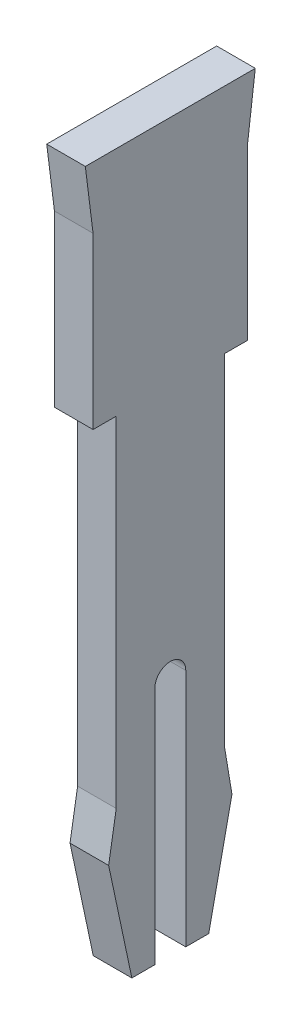
ISO-10303-21;
HEADER;
FILE_DESCRIPTION(('STEP AP214'),'2;1');
FILE_NAME('part.step','',(''),(''),'','','');
FILE_SCHEMA(('AUTOMOTIVE_DESIGN { 1 0 10303 214 1 1 1 1 }'));
ENDSEC;
DATA;
#1=APPLICATION_CONTEXT('core data for automotive mechanical design processes');
#2=APPLICATION_PROTOCOL_DEFINITION('international standard','automotive_design',2000,#1);
#3=PRODUCT_CONTEXT('',#1,'mechanical');
#4=PRODUCT('Part','Part','',(#3));
#5=PRODUCT_RELATED_PRODUCT_CATEGORY('part','',(#4));
#6=PRODUCT_DEFINITION_FORMATION('','',#4);
#7=PRODUCT_DEFINITION_CONTEXT('part definition',#1,'design');
#8=PRODUCT_DEFINITION('design','',#6,#7);
#9=PRODUCT_DEFINITION_SHAPE('','',#8);
#10=(LENGTH_UNIT() NAMED_UNIT(*) SI_UNIT(.MILLI.,.METRE.));
#11=(NAMED_UNIT(*) PLANE_ANGLE_UNIT() SI_UNIT($,.RADIAN.));
#12=(NAMED_UNIT(*) SI_UNIT($,.STERADIAN.) SOLID_ANGLE_UNIT());
#13=UNCERTAINTY_MEASURE_WITH_UNIT(LENGTH_MEASURE(1.E-05),#10,'distance_accuracy_value','');
#14=(GEOMETRIC_REPRESENTATION_CONTEXT(3) GLOBAL_UNCERTAINTY_ASSIGNED_CONTEXT((#13)) GLOBAL_UNIT_ASSIGNED_CONTEXT((#10,
#11,#12)) REPRESENTATION_CONTEXT('',''));
#15=CARTESIAN_POINT('',(0.,0.,0.));
#16=DIRECTION('',(0.,0.,1.));
#17=DIRECTION('',(1.,0.,0.));
#18=AXIS2_PLACEMENT_3D('',#15,#16,#17);
#19=CARTESIAN_POINT('',(6.5,1.325,32.27787898118));
#20=DIRECTION('',(0.,0.,1.));
#21=DIRECTION('',(1.,0.,0.));
#22=AXIS2_PLACEMENT_3D('',#19,#20,#21);
#23=PLANE('',#22);
#24=DIRECTION('',(0.,-1.,0.));
#25=VECTOR('',#24,1.);
#26=CARTESIAN_POINT('',(7.,-3.3,32.27787898118));
#27=LINE('',#26,#25);
#28=CARTESIAN_POINT('',(7.,-3.3,32.27787898118));
#29=VERTEX_POINT('',#28);
#30=CARTESIAN_POINT('',(7.,-6.4,32.27787898118));
#31=VERTEX_POINT('',#30);
#32=EDGE_CURVE('E282',#29,#31,#27,.T.);
#33=ORIENTED_EDGE('',*,*,#32,.F.);
#34=DIRECTION('',(1.,0.,0.));
#35=VECTOR('',#34,1.);
#36=CARTESIAN_POINT('',(6.5,-3.3,32.27787898118));
#37=LINE('',#36,#35);
#38=CARTESIAN_POINT('',(6.5,-3.3,32.27787898118));
#39=VERTEX_POINT('',#38);
#40=EDGE_CURVE('E244',#39,#29,#37,.T.);
#41=ORIENTED_EDGE('',*,*,#40,.F.);
#42=DIRECTION('',(0.,-1.,0.));
#43=VECTOR('',#42,1.);
#44=CARTESIAN_POINT('',(6.5,-3.3,32.27787898118));
#45=LINE('',#44,#43);
#46=CARTESIAN_POINT('',(6.5,-6.4,32.27787898118));
#47=VERTEX_POINT('',#46);
#48=EDGE_CURVE('E245',#39,#47,#45,.T.);
#49=ORIENTED_EDGE('',*,*,#48,.T.);
#50=DIRECTION('',(-1.,0.,0.));
#51=VECTOR('',#50,1.);
#52=CARTESIAN_POINT('',(7.,-6.4,32.27787898118));
#53=LINE('',#52,#51);
#54=EDGE_CURVE('E11',#31,#47,#53,.T.);
#55=ORIENTED_EDGE('',*,*,#54,.F.);
#56=EDGE_LOOP('',(#33,#41,#49,#55));
#57=FACE_BOUND('',#56,.T.);
#58=ADVANCED_FACE('F17',(#57),#23,.T.);
#59=CARTESIAN_POINT('',(7.,-6.4,32.47787898118));
#60=DIRECTION('',(0.,-1.,0.));
#61=DIRECTION('',(0.,0.,-1.));
#62=AXIS2_PLACEMENT_3D('',#59,#60,#61);
#63=PLANE('',#62);
#64=DIRECTION('',(-1.,0.,0.));
#65=VECTOR('',#64,1.);
#66=CARTESIAN_POINT('',(7.,-6.4,31.9801173963));
#67=LINE('',#66,#65);
#68=CARTESIAN_POINT('',(7.,-6.4,31.9801173963));
#69=VERTEX_POINT('',#68);
#70=CARTESIAN_POINT('',(6.5,-6.4,31.9801173963));
#71=VERTEX_POINT('',#70);
#72=EDGE_CURVE('E441',#69,#71,#67,.T.);
#73=ORIENTED_EDGE('',*,*,#72,.F.);
#74=DIRECTION('',(0.,0.,-1.));
#75=VECTOR('',#74,1.);
#76=CARTESIAN_POINT('',(7.,-6.4,32.27787898118));
#77=LINE('',#76,#75);
#78=EDGE_CURVE('E310',#31,#69,#77,.T.);
#79=ORIENTED_EDGE('',*,*,#78,.F.);
#80=ORIENTED_EDGE('',*,*,#54,.T.);
#81=DIRECTION('',(0.,0.,-1.));
#82=VECTOR('',#81,1.);
#83=CARTESIAN_POINT('',(6.5,-6.4,32.27787898118));
#84=LINE('',#83,#82);
#85=EDGE_CURVE('E278',#47,#71,#84,.T.);
#86=ORIENTED_EDGE('',*,*,#85,.T.);
#87=EDGE_LOOP('',(#73,#79,#80,#86));
#88=FACE_BOUND('',#87,.T.);
#89=ADVANCED_FACE('F422',(#88),#63,.T.);
#90=CARTESIAN_POINT('',(6.5,-4.987735989049,31.67963569184));
#91=DIRECTION('',(0.,-0.164398987305406,0.986393923832136));
#92=DIRECTION('',(-1.,0.,0.));
#93=AXIS2_PLACEMENT_3D('',#90,#91,#92);
#94=PLANE('',#93);
#95=DIRECTION('',(1.,-1.030286966852E-13,0.));
#96=VECTOR('',#95,1.);
#97=CARTESIAN_POINT('',(6.5,-4.39827625303,31.77787898118));
#98=LINE('',#97,#96);
#99=CARTESIAN_POINT('',(6.5,-4.39827625303,31.77787898118));
#100=VERTEX_POINT('',#99);
#101=CARTESIAN_POINT('',(7.,-4.39827625303,31.77787898118));
#102=VERTEX_POINT('',#101);
#103=EDGE_CURVE('E25',#100,#102,#98,.T.);
#104=ORIENTED_EDGE('',*,*,#103,.T.);
#105=DIRECTION('',(0.,0.986393923832136,0.164398987305406));
#106=VECTOR('',#105,1.);
#107=CARTESIAN_POINT('',(7.,-4.987735989049,31.67963569184));
#108=LINE('',#107,#106);
#109=CARTESIAN_POINT('',(7.,-4.987735989049,31.67963569184));
#110=VERTEX_POINT('',#109);
#111=EDGE_CURVE('E313',#110,#102,#108,.T.);
#112=ORIENTED_EDGE('',*,*,#111,.F.);
#113=DIRECTION('',(1.,0.,0.));
#114=VECTOR('',#113,1.);
#115=CARTESIAN_POINT('',(6.5,-4.987735989049,31.67963569184));
#116=LINE('',#115,#114);
#117=CARTESIAN_POINT('',(6.5,-4.987735989049,31.67963569184));
#118=VERTEX_POINT('',#117);
#119=EDGE_CURVE('E386',#118,#110,#116,.T.);
#120=ORIENTED_EDGE('',*,*,#119,.F.);
#121=DIRECTION('',(0.,-0.986393923832136,-0.164398987305406));
#122=VECTOR('',#121,1.);
#123=CARTESIAN_POINT('',(6.5,-4.39827625303,31.77787898118));
#124=LINE('',#123,#122);
#125=EDGE_CURVE('E275',#100,#118,#124,.T.);
#126=ORIENTED_EDGE('',*,*,#125,.F.);
#127=EDGE_LOOP('',(#104,#112,#120,#126));
#128=FACE_BOUND('',#127,.T.);
#129=ADVANCED_FACE('F384',(#128),#94,.F.);
#130=CARTESIAN_POINT('',(6.5,-4.39,31.77787898118));
#131=DIRECTION('',(0.,0.,1.));
#132=DIRECTION('',(1.,0.,0.));
#133=AXIS2_PLACEMENT_3D('',#130,#131,#132);
#134=PLANE('',#133);
#135=DIRECTION('',(1.,0.,0.));
#136=VECTOR('',#135,1.);
#137=CARTESIAN_POINT('',(6.5,0.,31.77787898118));
#138=LINE('',#137,#136);
#139=CARTESIAN_POINT('',(6.5,0.,31.77787898118));
#140=VERTEX_POINT('',#139);
#141=CARTESIAN_POINT('',(7.,0.,31.77787898118));
#142=VERTEX_POINT('',#141);
#143=EDGE_CURVE('E306',#140,#142,#138,.T.);
#144=ORIENTED_EDGE('',*,*,#143,.T.);
#145=DIRECTION('',(0.,-1.,0.));
#146=VECTOR('',#145,1.);
#147=CARTESIAN_POINT('',(7.,0.,31.77787898118));
#148=LINE('',#147,#146);
#149=EDGE_CURVE('E317',#142,#102,#148,.T.);
#150=ORIENTED_EDGE('',*,*,#149,.T.);
#151=ORIENTED_EDGE('',*,*,#103,.F.);
#152=DIRECTION('',(0.,1.,0.));
#153=VECTOR('',#152,1.);
#154=CARTESIAN_POINT('',(6.5,-4.39827625303,31.77787898118));
#155=LINE('',#154,#153);
#156=EDGE_CURVE('E265',#100,#140,#155,.T.);
#157=ORIENTED_EDGE('',*,*,#156,.T.);
#158=EDGE_LOOP('',(#144,#150,#151,#157));
#159=FACE_BOUND('',#158,.T.);
#160=ADVANCED_FACE('F368',(#159),#134,.F.);
#161=CARTESIAN_POINT('',(-3.,0.,31.47787898118));
#162=DIRECTION('',(0.,1.,0.));
#163=DIRECTION('',(1.,0.,0.));
#164=AXIS2_PLACEMENT_3D('',#161,#162,#163);
#165=PLANE('',#164);
#166=ORIENTED_EDGE('',*,*,#143,.F.);
#167=DIRECTION('',(0.,0.,-1.));
#168=VECTOR('',#167,1.);
#169=CARTESIAN_POINT('',(6.5,0.,31.77787898118));
#170=LINE('',#169,#168);
#171=CARTESIAN_POINT('',(6.5,0.,31.47787898118));
#172=VERTEX_POINT('',#171);
#173=EDGE_CURVE('E253',#140,#172,#170,.T.);
#174=ORIENTED_EDGE('',*,*,#173,.T.);
#175=DIRECTION('',(1.,0.,0.));
#176=VECTOR('',#175,1.);
#177=CARTESIAN_POINT('',(6.5,0.,31.47787898118));
#178=LINE('',#177,#176);
#179=CARTESIAN_POINT('',(7.,0.,31.47787898118));
#180=VERTEX_POINT('',#179);
#181=EDGE_CURVE('E260',#172,#180,#178,.T.);
#182=ORIENTED_EDGE('',*,*,#181,.T.);
#183=DIRECTION('',(0.,0.,1.));
#184=VECTOR('',#183,1.);
#185=CARTESIAN_POINT('',(7.,0.,31.47787898118));
#186=LINE('',#185,#184);
#187=EDGE_CURVE('E321',#180,#142,#186,.T.);
#188=ORIENTED_EDGE('',*,*,#187,.T.);
#189=EDGE_LOOP('',(#166,#174,#182,#188));
#190=FACE_BOUND('',#189,.T.);
#191=ADVANCED_FACE('F374',(#190),#165,.F.);
#192=CARTESIAN_POINT('',(7.,1.325,31.47787898118));
#193=DIRECTION('',(0.,0.,-1.));
#194=DIRECTION('',(0.,-1.,0.));
#195=AXIS2_PLACEMENT_3D('',#192,#193,#194);
#196=PLANE('',#195);
#197=ORIENTED_EDGE('',*,*,#181,.F.);
#198=DIRECTION('',(0.,1.,0.));
#199=VECTOR('',#198,1.);
#200=CARTESIAN_POINT('',(6.5,0.,31.47787898118));
#201=LINE('',#200,#199);
#202=CARTESIAN_POINT('',(6.5,2.2,31.47787898118));
#203=VERTEX_POINT('',#202);
#204=EDGE_CURVE('E206',#172,#203,#201,.T.);
#205=ORIENTED_EDGE('',*,*,#204,.T.);
#206=DIRECTION('',(-1.,0.,0.));
#207=VECTOR('',#206,1.);
#208=CARTESIAN_POINT('',(7.,2.2,31.47787898118));
#209=LINE('',#208,#207);
#210=CARTESIAN_POINT('',(7.,2.2,31.47787898118));
#211=VERTEX_POINT('',#210);
#212=EDGE_CURVE('E196',#211,#203,#209,.T.);
#213=ORIENTED_EDGE('',*,*,#212,.F.);
#214=DIRECTION('',(0.,1.,0.));
#215=VECTOR('',#214,1.);
#216=CARTESIAN_POINT('',(7.,0.,31.47787898118));
#217=LINE('',#216,#215);
#218=EDGE_CURVE('E325',#180,#211,#217,.T.);
#219=ORIENTED_EDGE('',*,*,#218,.F.);
#220=EDGE_LOOP('',(#197,#205,#213,#219));
#221=FACE_BOUND('',#220,.T.);
#222=ADVANCED_FACE('F390',(#221),#196,.T.);
#223=CARTESIAN_POINT('',(7.,1.215384615385,31.60095590426));
#224=DIRECTION('',(0.,-0.124034734589196,-0.992277876713669));
#225=DIRECTION('',(0.,-0.992277876713669,0.124034734589196));
#226=AXIS2_PLACEMENT_3D('',#223,#224,#225);
#227=PLANE('',#226);
#228=DIRECTION('',(0.,0.992277876713669,-0.124034734589196));
#229=VECTOR('',#228,1.);
#230=CARTESIAN_POINT('',(7.,2.2,31.47787898118));
#231=LINE('',#230,#229);
#232=CARTESIAN_POINT('',(7.,3.,31.37787898118));
#233=VERTEX_POINT('',#232);
#234=EDGE_CURVE('E329',#211,#233,#231,.T.);
#235=ORIENTED_EDGE('',*,*,#234,.F.);
#236=ORIENTED_EDGE('',*,*,#212,.T.);
#237=DIRECTION('',(0.,-0.992277876713669,0.124034734589196));
#238=VECTOR('',#237,1.);
#239=CARTESIAN_POINT('',(6.5,3.,31.37787898118));
#240=LINE('',#239,#238);
#241=CARTESIAN_POINT('',(6.5,3.,31.37787898118));
#242=VERTEX_POINT('',#241);
#243=EDGE_CURVE('E200',#242,#203,#240,.T.);
#244=ORIENTED_EDGE('',*,*,#243,.F.);
#245=DIRECTION('',(-1.,0.,0.));
#246=VECTOR('',#245,1.);
#247=CARTESIAN_POINT('',(7.,3.,31.37787898118));
#248=LINE('',#247,#246);
#249=EDGE_CURVE('E184',#233,#242,#248,.T.);
#250=ORIENTED_EDGE('',*,*,#249,.F.);
#251=EDGE_LOOP('',(#235,#236,#244,#250));
#252=FACE_BOUND('',#251,.T.);
#253=ADVANCED_FACE('F201',(#252),#227,.T.);
#254=CARTESIAN_POINT('',(7.,3.,32.47787898118));
#255=DIRECTION('',(0.,1.,0.));
#256=DIRECTION('',(1.,0.,0.));
#257=AXIS2_PLACEMENT_3D('',#254,#255,#256);
#258=PLANE('',#257);
#259=DIRECTION('',(0.,0.,1.));
#260=VECTOR('',#259,1.);
#261=CARTESIAN_POINT('',(7.,3.,31.37787898118));
#262=LINE('',#261,#260);
#263=CARTESIAN_POINT('',(7.,3.,33.57787898118));
#264=VERTEX_POINT('',#263);
#265=EDGE_CURVE('E191',#233,#264,#262,.T.);
#266=ORIENTED_EDGE('',*,*,#265,.F.);
#267=ORIENTED_EDGE('',*,*,#249,.T.);
#268=DIRECTION('',(0.,0.,1.));
#269=VECTOR('',#268,1.);
#270=CARTESIAN_POINT('',(6.5,3.,31.37787898118));
#271=LINE('',#270,#269);
#272=CARTESIAN_POINT('',(6.5,3.,33.57787898118));
#273=VERTEX_POINT('',#272);
#274=EDGE_CURVE('E188',#242,#273,#271,.T.);
#275=ORIENTED_EDGE('',*,*,#274,.T.);
#276=DIRECTION('',(-1.,0.,0.));
#277=VECTOR('',#276,1.);
#278=CARTESIAN_POINT('',(7.,3.,33.57787898118));
#279=LINE('',#278,#277);
#280=EDGE_CURVE('E197',#264,#273,#279,.T.);
#281=ORIENTED_EDGE('',*,*,#280,.F.);
#282=EDGE_LOOP('',(#266,#267,#275,#281));
#283=FACE_BOUND('',#282,.T.);
#284=ADVANCED_FACE('F186',(#283),#258,.T.);
#285=CARTESIAN_POINT('',(7.,1.215384615385,33.3548020581));
#286=DIRECTION('',(0.,0.124034734589196,-0.992277876713669));
#287=DIRECTION('',(-1.,0.,0.));
#288=AXIS2_PLACEMENT_3D('',#285,#286,#287);
#289=PLANE('',#288);
#290=DIRECTION('',(0.,0.992277876713669,0.124034734589196));
#291=VECTOR('',#290,1.);
#292=CARTESIAN_POINT('',(6.5,2.2,33.47787898118));
#293=LINE('',#292,#291);
#294=CARTESIAN_POINT('',(6.5,2.2,33.47787898118));
#295=VERTEX_POINT('',#294);
#296=EDGE_CURVE('E212',#295,#273,#293,.T.);
#297=ORIENTED_EDGE('',*,*,#296,.F.);
#298=DIRECTION('',(1.,-1.15463194561E-13,0.));
#299=VECTOR('',#298,1.);
#300=CARTESIAN_POINT('',(6.5,2.2,33.47787898118));
#301=LINE('',#300,#299);
#302=CARTESIAN_POINT('',(7.,2.2,33.47787898118));
#303=VERTEX_POINT('',#302);
#304=EDGE_CURVE('E362',#295,#303,#301,.T.);
#305=ORIENTED_EDGE('',*,*,#304,.T.);
#306=DIRECTION('',(0.,-0.992277876713669,-0.124034734589196));
#307=VECTOR('',#306,1.);
#308=CARTESIAN_POINT('',(7.,3.,33.57787898118));
#309=LINE('',#308,#307);
#310=EDGE_CURVE('E334',#264,#303,#309,.T.);
#311=ORIENTED_EDGE('',*,*,#310,.F.);
#312=ORIENTED_EDGE('',*,*,#280,.T.);
#313=EDGE_LOOP('',(#297,#305,#311,#312));
#314=FACE_BOUND('',#313,.T.);
#315=ADVANCED_FACE('F395',(#314),#289,.F.);
#316=CARTESIAN_POINT('',(7.,1.325,33.47787898118));
#317=DIRECTION('',(0.,0.,-1.));
#318=DIRECTION('',(0.,-1.,0.));
#319=AXIS2_PLACEMENT_3D('',#316,#317,#318);
#320=PLANE('',#319);
#321=ORIENTED_EDGE('',*,*,#304,.F.);
#322=DIRECTION('',(0.,-1.,0.));
#323=VECTOR('',#322,1.);
#324=CARTESIAN_POINT('',(6.5,2.2,33.47787898118));
#325=LINE('',#324,#323);
#326=CARTESIAN_POINT('',(6.5,0.,33.47787898118));
#327=VERTEX_POINT('',#326);
#328=EDGE_CURVE('E221',#295,#327,#325,.T.);
#329=ORIENTED_EDGE('',*,*,#328,.T.);
#330=DIRECTION('',(1.,0.,0.));
#331=VECTOR('',#330,1.);
#332=CARTESIAN_POINT('',(6.5,0.,33.47787898118));
#333=LINE('',#332,#331);
#334=CARTESIAN_POINT('',(7.,0.,33.47787898118));
#335=VERTEX_POINT('',#334);
#336=EDGE_CURVE('E359',#327,#335,#333,.T.);
#337=ORIENTED_EDGE('',*,*,#336,.T.);
#338=DIRECTION('',(0.,1.,0.));
#339=VECTOR('',#338,1.);
#340=CARTESIAN_POINT('',(7.,0.,33.47787898118));
#341=LINE('',#340,#339);
#342=EDGE_CURVE('E338',#335,#303,#341,.T.);
#343=ORIENTED_EDGE('',*,*,#342,.T.);
#344=EDGE_LOOP('',(#321,#329,#337,#343));
#345=FACE_BOUND('',#344,.T.);
#346=ADVANCED_FACE('F398',(#345),#320,.F.);
#347=CARTESIAN_POINT('',(-3.,0.,33.27787898118));
#348=DIRECTION('',(0.,1.,0.));
#349=DIRECTION('',(1.,0.,0.));
#350=AXIS2_PLACEMENT_3D('',#347,#348,#349);
#351=PLANE('',#350);
#352=ORIENTED_EDGE('',*,*,#336,.F.);
#353=DIRECTION('',(0.,0.,-1.));
#354=VECTOR('',#353,1.);
#355=CARTESIAN_POINT('',(6.5,0.,33.47787898118));
#356=LINE('',#355,#354);
#357=CARTESIAN_POINT('',(6.5,0.,33.17787898118));
#358=VERTEX_POINT('',#357);
#359=EDGE_CURVE('E235',#327,#358,#356,.T.);
#360=ORIENTED_EDGE('',*,*,#359,.T.);
#361=DIRECTION('',(1.,0.,0.));
#362=VECTOR('',#361,1.);
#363=CARTESIAN_POINT('',(6.5,0.,33.17787898118));
#364=LINE('',#363,#362);
#365=CARTESIAN_POINT('',(7.,0.,33.17787898118));
#366=VERTEX_POINT('',#365);
#367=EDGE_CURVE('E356',#358,#366,#364,.T.);
#368=ORIENTED_EDGE('',*,*,#367,.T.);
#369=DIRECTION('',(0.,0.,1.));
#370=VECTOR('',#369,1.);
#371=CARTESIAN_POINT('',(7.,0.,33.17787898118));
#372=LINE('',#371,#370);
#373=EDGE_CURVE('E342',#366,#335,#372,.T.);
#374=ORIENTED_EDGE('',*,*,#373,.T.);
#375=EDGE_LOOP('',(#352,#360,#368,#374));
#376=FACE_BOUND('',#375,.T.);
#377=ADVANCED_FACE('F401',(#376),#351,.F.);
#378=CARTESIAN_POINT('',(6.5,0.,33.17787898118));
#379=DIRECTION('',(0.,0.,-1.));
#380=DIRECTION('',(0.,-1.,0.));
#381=AXIS2_PLACEMENT_3D('',#378,#379,#380);
#382=PLANE('',#381);
#383=DIRECTION('',(1.,0.,0.));
#384=VECTOR('',#383,1.);
#385=CARTESIAN_POINT('',(6.5,-4.39827625303,33.17787898118));
#386=LINE('',#385,#384);
#387=CARTESIAN_POINT('',(6.5,-4.39827625303,33.17787898118));
#388=VERTEX_POINT('',#387);
#389=CARTESIAN_POINT('',(7.,-4.39827625303,33.17787898118));
#390=VERTEX_POINT('',#389);
#391=EDGE_CURVE('E47',#388,#390,#386,.T.);
#392=ORIENTED_EDGE('',*,*,#391,.T.);
#393=DIRECTION('',(0.,1.,0.));
#394=VECTOR('',#393,1.);
#395=CARTESIAN_POINT('',(7.,-4.39827625303,33.17787898118));
#396=LINE('',#395,#394);
#397=EDGE_CURVE('E271',#390,#366,#396,.T.);
#398=ORIENTED_EDGE('',*,*,#397,.T.);
#399=ORIENTED_EDGE('',*,*,#367,.F.);
#400=DIRECTION('',(0.,-1.,0.));
#401=VECTOR('',#400,1.);
#402=CARTESIAN_POINT('',(6.5,0.,33.17787898118));
#403=LINE('',#402,#401);
#404=EDGE_CURVE('E239',#358,#388,#403,.T.);
#405=ORIENTED_EDGE('',*,*,#404,.T.);
#406=EDGE_LOOP('',(#392,#398,#399,#405));
#407=FACE_BOUND('',#406,.T.);
#408=ADVANCED_FACE('F403',(#407),#382,.F.);
#409=CARTESIAN_POINT('',(6.5,-4.39827625303,33.17787898118));
#410=DIRECTION('',(0.,-0.164398987305406,-0.986393923832136));
#411=DIRECTION('',(0.,-0.986393923832136,0.164398987305406));
#412=AXIS2_PLACEMENT_3D('',#409,#410,#411);
#413=PLANE('',#412);
#414=DIRECTION('',(1.,0.,0.));
#415=VECTOR('',#414,1.);
#416=CARTESIAN_POINT('',(6.5,-4.987735989049,33.27612227052));
#417=LINE('',#416,#415);
#418=CARTESIAN_POINT('',(6.5,-4.987735989049,33.27612227052));
#419=VERTEX_POINT('',#418);
#420=CARTESIAN_POINT('',(7.,-4.987735989049,33.27612227052));
#421=VERTEX_POINT('',#420);
#422=EDGE_CURVE('E37',#419,#421,#417,.T.);
#423=ORIENTED_EDGE('',*,*,#422,.T.);
#424=DIRECTION('',(0.,-0.986393923832136,0.164398987305406));
#425=VECTOR('',#424,1.);
#426=CARTESIAN_POINT('',(7.,-4.39827625303,33.17787898118));
#427=LINE('',#426,#425);
#428=EDGE_CURVE('E266',#390,#421,#427,.T.);
#429=ORIENTED_EDGE('',*,*,#428,.F.);
#430=ORIENTED_EDGE('',*,*,#391,.F.);
#431=DIRECTION('',(0.,0.986393923832136,-0.164398987305406));
#432=VECTOR('',#431,1.);
#433=CARTESIAN_POINT('',(6.5,-4.987735989049,33.27612227052));
#434=LINE('',#433,#432);
#435=EDGE_CURVE('E234',#419,#388,#434,.T.);
#436=ORIENTED_EDGE('',*,*,#435,.F.);
#437=EDGE_LOOP('',(#423,#429,#430,#436));
#438=FACE_BOUND('',#437,.T.);
#439=ADVANCED_FACE('F407',(#438),#413,.F.);
#440=CARTESIAN_POINT('',(6.5,-4.987735989049,33.27612227052));
#441=DIRECTION('',(0.,0.208107644464906,-0.978105928984825));
#442=DIRECTION('',(-1.,0.,0.));
#443=AXIS2_PLACEMENT_3D('',#440,#441,#442);
#444=PLANE('',#443);
#445=DIRECTION('',(1.,0.,0.));
#446=VECTOR('',#445,1.);
#447=CARTESIAN_POINT('',(6.5,-6.4,32.97564056606));
#448=LINE('',#447,#446);
#449=CARTESIAN_POINT('',(6.5,-6.4,32.97564056606));
#450=VERTEX_POINT('',#449);
#451=CARTESIAN_POINT('',(7.,-6.4,32.97564056606));
#452=VERTEX_POINT('',#451);
#453=EDGE_CURVE('E283',#450,#452,#448,.T.);
#454=ORIENTED_EDGE('',*,*,#453,.T.);
#455=DIRECTION('',(0.,-0.978105928984826,-0.208107644464906));
#456=VECTOR('',#455,1.);
#457=CARTESIAN_POINT('',(7.,-4.987735989049,33.27612227052));
#458=LINE('',#457,#456);
#459=EDGE_CURVE('E270',#421,#452,#458,.T.);
#460=ORIENTED_EDGE('',*,*,#459,.F.);
#461=ORIENTED_EDGE('',*,*,#422,.F.);
#462=DIRECTION('',(0.,0.978105928984826,0.208107644464906));
#463=VECTOR('',#462,1.);
#464=CARTESIAN_POINT('',(6.5,-6.4,32.97564056606));
#465=LINE('',#464,#463);
#466=EDGE_CURVE('E230',#450,#419,#465,.T.);
#467=ORIENTED_EDGE('',*,*,#466,.F.);
#468=EDGE_LOOP('',(#454,#460,#461,#467));
#469=FACE_BOUND('',#468,.T.);
#470=ADVANCED_FACE('F409',(#469),#444,.F.);
#471=CARTESIAN_POINT('',(7.,1.325,32.47787898118));
#472=DIRECTION('',(1.,0.,0.));
#473=DIRECTION('',(0.,1.,0.));
#474=AXIS2_PLACEMENT_3D('',#471,#472,#473);
#475=PLANE('',#474);
#476=ORIENTED_EDGE('',*,*,#32,.T.);
#477=ORIENTED_EDGE('',*,*,#78,.T.);
#478=DIRECTION('',(0.,0.978105928984826,-0.208107644464906));
#479=VECTOR('',#478,1.);
#480=CARTESIAN_POINT('',(7.,-6.4,31.9801173963));
#481=LINE('',#480,#479);
#482=EDGE_CURVE('E380',#69,#110,#481,.T.);
#483=ORIENTED_EDGE('',*,*,#482,.T.);
#484=ORIENTED_EDGE('',*,*,#111,.T.);
#485=ORIENTED_EDGE('',*,*,#149,.F.);
#486=ORIENTED_EDGE('',*,*,#187,.F.);
#487=ORIENTED_EDGE('',*,*,#218,.T.);
#488=ORIENTED_EDGE('',*,*,#234,.T.);
#489=ORIENTED_EDGE('',*,*,#265,.T.);
#490=ORIENTED_EDGE('',*,*,#310,.T.);
#491=ORIENTED_EDGE('',*,*,#342,.F.);
#492=ORIENTED_EDGE('',*,*,#373,.F.);
#493=ORIENTED_EDGE('',*,*,#397,.F.);
#494=ORIENTED_EDGE('',*,*,#428,.T.);
#495=ORIENTED_EDGE('',*,*,#459,.T.);
#496=DIRECTION('',(0.,0.,-1.));
#497=VECTOR('',#496,1.);
#498=CARTESIAN_POINT('',(7.,-6.4,32.97564056606));
#499=LINE('',#498,#497);
#500=CARTESIAN_POINT('',(7.,-6.4,32.67787898118));
#501=VERTEX_POINT('',#500);
#502=EDGE_CURVE('E279',#452,#501,#499,.T.);
#503=ORIENTED_EDGE('',*,*,#502,.T.);
#504=DIRECTION('',(0.,1.,0.));
#505=VECTOR('',#504,1.);
#506=CARTESIAN_POINT('',(7.,-6.4,32.67787898118));
#507=LINE('',#506,#505);
#508=CARTESIAN_POINT('',(7.,-3.3,32.67787898118));
#509=VERTEX_POINT('',#508);
#510=EDGE_CURVE('E298',#501,#509,#507,.T.);
#511=ORIENTED_EDGE('',*,*,#510,.T.);
#512=CARTESIAN_POINT('',(7.,-3.3,32.47787898118));
#513=DIRECTION('',(-1.,0.,0.));
#514=DIRECTION('',(0.,-1.06581410364E-13,1.));
#515=AXIS2_PLACEMENT_3D('',#512,#513,#514);
#516=CIRCLE('',#515,0.2);
#517=EDGE_CURVE('E254',#509,#29,#516,.T.);
#518=ORIENTED_EDGE('',*,*,#517,.T.);
#519=EDGE_LOOP('',(#476,#477,#483,#484,#485,#486,#487,#488,#489,#490,#491,#492,#493,#494,#495,
#503,#511,#518));
#520=FACE_BOUND('',#519,.T.);
#521=ADVANCED_FACE('F377',(#520),#475,.T.);
#522=CARTESIAN_POINT('',(7.,-6.4,32.47787898118));
#523=DIRECTION('',(0.,-1.,0.));
#524=DIRECTION('',(0.,0.,-1.));
#525=AXIS2_PLACEMENT_3D('',#522,#523,#524);
#526=PLANE('',#525);
#527=ORIENTED_EDGE('',*,*,#453,.F.);
#528=DIRECTION('',(0.,0.,-1.));
#529=VECTOR('',#528,1.);
#530=CARTESIAN_POINT('',(6.5,-6.4,32.97564056606));
#531=LINE('',#530,#529);
#532=CARTESIAN_POINT('',(6.5,-6.4,32.67787898118));
#533=VERTEX_POINT('',#532);
#534=EDGE_CURVE('E227',#450,#533,#531,.T.);
#535=ORIENTED_EDGE('',*,*,#534,.T.);
#536=DIRECTION('',(1.,0.,0.));
#537=VECTOR('',#536,1.);
#538=CARTESIAN_POINT('',(6.5,-6.4,32.67787898118));
#539=LINE('',#538,#537);
#540=EDGE_CURVE('E295',#533,#501,#539,.T.);
#541=ORIENTED_EDGE('',*,*,#540,.T.);
#542=ORIENTED_EDGE('',*,*,#502,.F.);
#543=EDGE_LOOP('',(#527,#535,#541,#542));
#544=FACE_BOUND('',#543,.T.);
#545=ADVANCED_FACE('F463',(#544),#526,.T.);
#546=CARTESIAN_POINT('',(6.5,1.325,32.67787898118));
#547=DIRECTION('',(0.,0.,-1.));
#548=DIRECTION('',(0.,-1.,0.));
#549=AXIS2_PLACEMENT_3D('',#546,#547,#548);
#550=PLANE('',#549);
#551=ORIENTED_EDGE('',*,*,#510,.F.);
#552=ORIENTED_EDGE('',*,*,#540,.F.);
#553=DIRECTION('',(0.,1.,0.));
#554=VECTOR('',#553,1.);
#555=CARTESIAN_POINT('',(6.5,-6.4,32.67787898118));
#556=LINE('',#555,#554);
#557=CARTESIAN_POINT('',(6.5,-3.3,32.67787898118));
#558=VERTEX_POINT('',#557);
#559=EDGE_CURVE('E225',#533,#558,#556,.T.);
#560=ORIENTED_EDGE('',*,*,#559,.T.);
#561=DIRECTION('',(-1.,0.,0.));
#562=VECTOR('',#561,1.);
#563=CARTESIAN_POINT('',(7.,-3.3,32.67787898118));
#564=LINE('',#563,#562);
#565=EDGE_CURVE('E257',#509,#558,#564,.T.);
#566=ORIENTED_EDGE('',*,*,#565,.F.);
#567=EDGE_LOOP('',(#551,#552,#560,#566));
#568=FACE_BOUND('',#567,.T.);
#569=ADVANCED_FACE('F461',(#568),#550,.T.);
#570=CARTESIAN_POINT('',(6.5,-3.3,32.47787898118));
#571=DIRECTION('',(1.,0.,0.));
#572=DIRECTION('',(0.,0.,-1.));
#573=AXIS2_PLACEMENT_3D('',#570,#571,#572);
#574=CYLINDRICAL_SURFACE('',#573,0.2);
#575=ORIENTED_EDGE('',*,*,#40,.T.);
#576=ORIENTED_EDGE('',*,*,#517,.F.);
#577=ORIENTED_EDGE('',*,*,#565,.T.);
#578=CARTESIAN_POINT('',(6.5,-3.3,32.47787898118));
#579=DIRECTION('',(1.,0.,0.));
#580=DIRECTION('',(0.,0.,-1.));
#581=AXIS2_PLACEMENT_3D('',#578,#579,#580);
#582=CIRCLE('',#581,0.2);
#583=EDGE_CURVE('E240',#39,#558,#582,.T.);
#584=ORIENTED_EDGE('',*,*,#583,.F.);
#585=EDGE_LOOP('',(#575,#576,#577,#584));
#586=FACE_BOUND('',#585,.T.);
#587=ADVANCED_FACE('F434',(#586),#574,.F.);
#588=CARTESIAN_POINT('',(6.5,1.325,32.47787898118));
#589=DIRECTION('',(-1.,0.,0.));
#590=DIRECTION('',(0.,0.,1.));
#591=AXIS2_PLACEMENT_3D('',#588,#589,#590);
#592=PLANE('',#591);
#593=ORIENTED_EDGE('',*,*,#559,.F.);
#594=ORIENTED_EDGE('',*,*,#534,.F.);
#595=ORIENTED_EDGE('',*,*,#466,.T.);
#596=ORIENTED_EDGE('',*,*,#435,.T.);
#597=ORIENTED_EDGE('',*,*,#404,.F.);
#598=ORIENTED_EDGE('',*,*,#359,.F.);
#599=ORIENTED_EDGE('',*,*,#328,.F.);
#600=ORIENTED_EDGE('',*,*,#296,.T.);
#601=ORIENTED_EDGE('',*,*,#274,.F.);
#602=ORIENTED_EDGE('',*,*,#243,.T.);
#603=ORIENTED_EDGE('',*,*,#204,.F.);
#604=ORIENTED_EDGE('',*,*,#173,.F.);
#605=ORIENTED_EDGE('',*,*,#156,.F.);
#606=ORIENTED_EDGE('',*,*,#125,.T.);
#607=DIRECTION('',(0.,-0.978105928984826,0.208107644464906));
#608=VECTOR('',#607,1.);
#609=CARTESIAN_POINT('',(6.5,-4.987735989049,31.67963569184));
#610=LINE('',#609,#608);
#611=EDGE_CURVE('E438',#118,#71,#610,.T.);
#612=ORIENTED_EDGE('',*,*,#611,.T.);
#613=ORIENTED_EDGE('',*,*,#85,.F.);
#614=ORIENTED_EDGE('',*,*,#48,.F.);
#615=ORIENTED_EDGE('',*,*,#583,.T.);
#616=EDGE_LOOP('',(#593,#594,#595,#596,#597,#598,#599,#600,#601,#602,#603,#604,#605,#606,#612,
#613,#614,#615));
#617=FACE_BOUND('',#616,.T.);
#618=ADVANCED_FACE('F209',(#617),#592,.T.);
#619=CARTESIAN_POINT('',(6.5,-6.4,31.9801173963));
#620=DIRECTION('',(0.,0.208107644464906,0.978105928984825));
#621=DIRECTION('',(1.,0.,0.));
#622=AXIS2_PLACEMENT_3D('',#619,#620,#621);
#623=PLANE('',#622);
#624=ORIENTED_EDGE('',*,*,#119,.T.);
#625=ORIENTED_EDGE('',*,*,#482,.F.);
#626=ORIENTED_EDGE('',*,*,#72,.T.);
#627=ORIENTED_EDGE('',*,*,#611,.F.);
#628=EDGE_LOOP('',(#624,#625,#626,#627));
#629=FACE_BOUND('',#628,.T.);
#630=ADVANCED_FACE('F445',(#629),#623,.F.);
#631=CLOSED_SHELL('',(#58,#89,#129,#160,#191,#222,#253,#284,#315,#346,#377,#408,#439,#470,#521,
#545,#569,#587,#618,#630));
#632=MANIFOLD_SOLID_BREP('B1',#631);
#633=ADVANCED_BREP_SHAPE_REPRESENTATION('',(#18,#632),#14);
#634=SHAPE_DEFINITION_REPRESENTATION(#9,#633);
ENDSEC;
END-ISO-10303-21;
